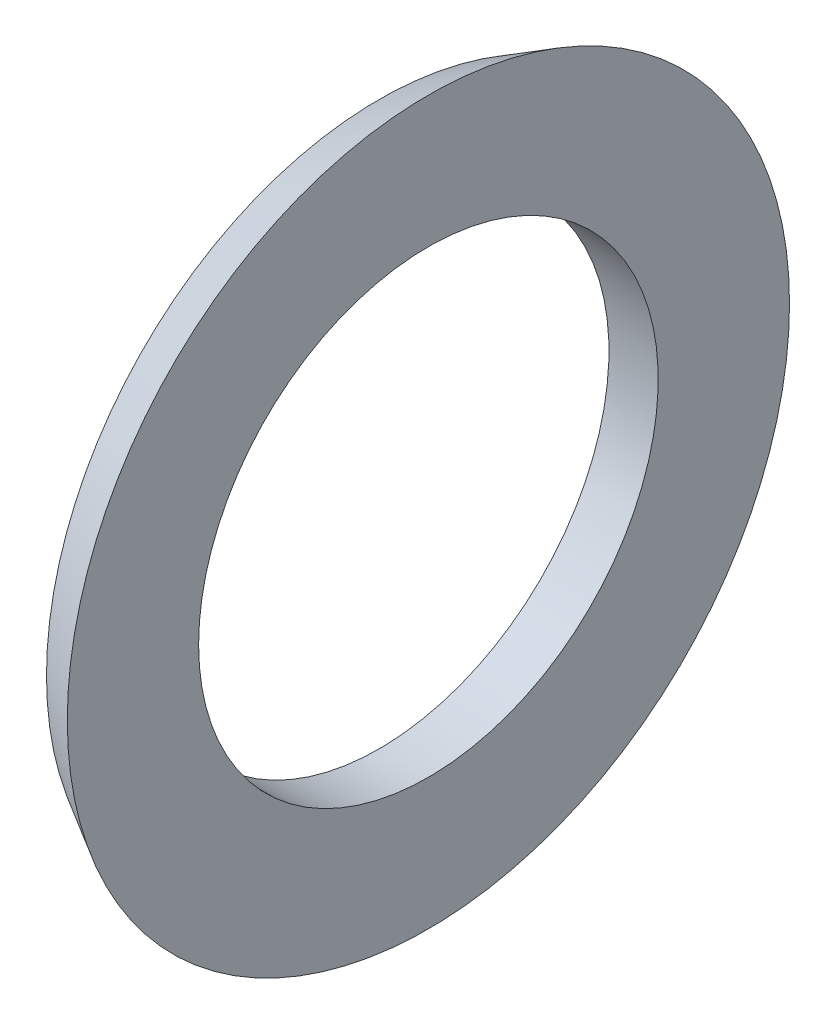
ISO-10303-21;
HEADER;
FILE_DESCRIPTION(('STEP AP214'),'2;1');
FILE_NAME('part.step','',(''),(''),'','','');
FILE_SCHEMA(('AUTOMOTIVE_DESIGN { 1 0 10303 214 1 1 1 1 }'));
ENDSEC;
DATA;
#1=APPLICATION_CONTEXT('core data for automotive mechanical design processes');
#2=APPLICATION_PROTOCOL_DEFINITION('international standard','automotive_design',2000,#1);
#3=PRODUCT_CONTEXT('',#1,'mechanical');
#4=PRODUCT('Part','Part','',(#3));
#5=PRODUCT_RELATED_PRODUCT_CATEGORY('part','',(#4));
#6=PRODUCT_DEFINITION_FORMATION('','',#4);
#7=PRODUCT_DEFINITION_CONTEXT('part definition',#1,'design');
#8=PRODUCT_DEFINITION('design','',#6,#7);
#9=PRODUCT_DEFINITION_SHAPE('','',#8);
#10=(LENGTH_UNIT() NAMED_UNIT(*) SI_UNIT(.MILLI.,.METRE.));
#11=(NAMED_UNIT(*) PLANE_ANGLE_UNIT() SI_UNIT($,.RADIAN.));
#12=(NAMED_UNIT(*) SI_UNIT($,.STERADIAN.) SOLID_ANGLE_UNIT());
#13=UNCERTAINTY_MEASURE_WITH_UNIT(LENGTH_MEASURE(1.E-05),#10,'distance_accuracy_value','');
#14=(GEOMETRIC_REPRESENTATION_CONTEXT(3) GLOBAL_UNCERTAINTY_ASSIGNED_CONTEXT((#13)) GLOBAL_UNIT_ASSIGNED_CONTEXT((#10,
#11,#12)) REPRESENTATION_CONTEXT('',''));
#15=CARTESIAN_POINT('',(0.,0.,0.));
#16=DIRECTION('',(0.,0.,1.));
#17=DIRECTION('',(1.,0.,0.));
#18=AXIS2_PLACEMENT_3D('',#15,#16,#17);
#19=CARTESIAN_POINT('',(-20.,0.,0.));
#20=DIRECTION('',(-1.,0.,0.));
#21=DIRECTION('',(0.,0.,1.));
#22=AXIS2_PLACEMENT_3D('',#19,#20,#21);
#23=CYLINDRICAL_SURFACE('',#22,14.);
#24=CARTESIAN_POINT('',(3.,0.,0.));
#25=DIRECTION('',(-1.,0.,0.));
#26=DIRECTION('',(0.,0.,1.));
#27=AXIS2_PLACEMENT_3D('',#24,#25,#26);
#28=CIRCLE('',#27,14.);
#29=CARTESIAN_POINT('',(3.,0.,14.));
#30=VERTEX_POINT('',#29);
#31=EDGE_CURVE('E45',#30,#30,#28,.T.);
#32=ORIENTED_EDGE('',*,*,#31,.F.);
#33=EDGE_LOOP('',(#32));
#34=FACE_BOUND('',#33,.T.);
#35=CARTESIAN_POINT('',(0.,0.,0.));
#36=DIRECTION('',(-1.,0.,0.));
#37=DIRECTION('',(0.,0.,1.));
#38=AXIS2_PLACEMENT_3D('',#35,#36,#37);
#39=CIRCLE('',#38,14.);
#40=CARTESIAN_POINT('',(0.,0.,14.));
#41=VERTEX_POINT('',#40);
#42=EDGE_CURVE('E10',#41,#41,#39,.T.);
#43=ORIENTED_EDGE('',*,*,#42,.T.);
#44=EDGE_LOOP('',(#43));
#45=FACE_BOUND('',#44,.T.);
#46=ADVANCED_FACE('F31',(#34,#45),#23,.F.);
#47=CARTESIAN_POINT('',(0.,14.,0.));
#48=DIRECTION('',(1.,0.,0.));
#49=DIRECTION('',(0.,0.,-1.));
#50=AXIS2_PLACEMENT_3D('',#47,#48,#49);
#51=PLANE('',#50);
#52=ORIENTED_EDGE('',*,*,#42,.F.);
#53=EDGE_LOOP('',(#52));
#54=FACE_BOUND('',#53,.T.);
#55=CARTESIAN_POINT('',(0.,0.,0.));
#56=DIRECTION('',(-1.,0.,0.));
#57=DIRECTION('',(0.,0.,1.));
#58=AXIS2_PLACEMENT_3D('',#55,#56,#57);
#59=CIRCLE('',#58,20.2679491924311);
#60=CARTESIAN_POINT('',(0.,0.,20.2679491924311));
#61=VERTEX_POINT('',#60);
#62=EDGE_CURVE('E37',#61,#61,#59,.T.);
#63=ORIENTED_EDGE('',*,*,#62,.T.);
#64=EDGE_LOOP('',(#63));
#65=FACE_BOUND('',#64,.T.);
#66=ADVANCED_FACE('F54',(#54,#65),#51,.F.);
#67=CARTESIAN_POINT('',(3.,0.,0.));
#68=DIRECTION('',(1.,0.,0.));
#69=DIRECTION('',(0.,0.,-1.));
#70=AXIS2_PLACEMENT_3D('',#67,#68,#69);
#71=CONICAL_SURFACE('',#70,22.,0.523598775598293);
#72=ORIENTED_EDGE('',*,*,#62,.F.);
#73=EDGE_LOOP('',(#72));
#74=FACE_BOUND('',#73,.T.);
#75=CARTESIAN_POINT('',(3.,0.,0.));
#76=DIRECTION('',(-1.,0.,0.));
#77=DIRECTION('',(0.,0.,1.));
#78=AXIS2_PLACEMENT_3D('',#75,#76,#77);
#79=CIRCLE('',#78,22.);
#80=CARTESIAN_POINT('',(3.,0.,22.));
#81=VERTEX_POINT('',#80);
#82=EDGE_CURVE('E41',#81,#81,#79,.T.);
#83=ORIENTED_EDGE('',*,*,#82,.T.);
#84=EDGE_LOOP('',(#83));
#85=FACE_BOUND('',#84,.T.);
#86=ADVANCED_FACE('F58',(#74,#85),#71,.T.);
#87=CARTESIAN_POINT('',(3.,22.,0.));
#88=DIRECTION('',(-1.,0.,0.));
#89=DIRECTION('',(0.,0.,1.));
#90=AXIS2_PLACEMENT_3D('',#87,#88,#89);
#91=PLANE('',#90);
#92=ORIENTED_EDGE('',*,*,#82,.F.);
#93=EDGE_LOOP('',(#92));
#94=FACE_BOUND('',#93,.T.);
#95=ORIENTED_EDGE('',*,*,#31,.T.);
#96=EDGE_LOOP('',(#95));
#97=FACE_BOUND('',#96,.T.);
#98=ADVANCED_FACE('F51',(#94,#97),#91,.F.);
#99=CLOSED_SHELL('',(#46,#66,#86,#98));
#100=MANIFOLD_SOLID_BREP('B2',#99);
#101=ADVANCED_BREP_SHAPE_REPRESENTATION('',(#18,#100),#14);
#102=SHAPE_DEFINITION_REPRESENTATION(#9,#101);
ENDSEC;
END-ISO-10303-21;
